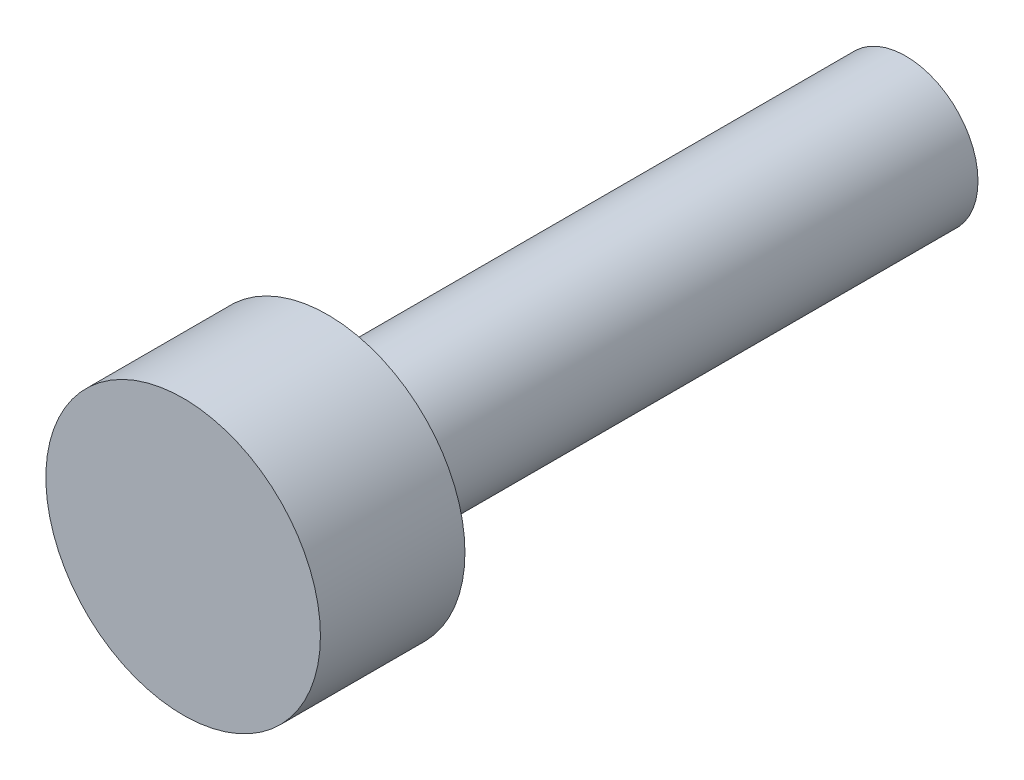
ISO-10303-21;
HEADER;
FILE_DESCRIPTION(('STEP AP214'),'2;1');
FILE_NAME('part.step','',(''),(''),'','','');
FILE_SCHEMA(('AUTOMOTIVE_DESIGN { 1 0 10303 214 1 1 1 1 }'));
ENDSEC;
DATA;
#1=APPLICATION_CONTEXT('core data for automotive mechanical design processes');
#2=APPLICATION_PROTOCOL_DEFINITION('international standard','automotive_design',2000,#1);
#3=PRODUCT_CONTEXT('',#1,'mechanical');
#4=PRODUCT('Part','Part','',(#3));
#5=PRODUCT_RELATED_PRODUCT_CATEGORY('part','',(#4));
#6=PRODUCT_DEFINITION_FORMATION('','',#4);
#7=PRODUCT_DEFINITION_CONTEXT('part definition',#1,'design');
#8=PRODUCT_DEFINITION('design','',#6,#7);
#9=PRODUCT_DEFINITION_SHAPE('','',#8);
#10=(LENGTH_UNIT() NAMED_UNIT(*) SI_UNIT(.MILLI.,.METRE.));
#11=(NAMED_UNIT(*) PLANE_ANGLE_UNIT() SI_UNIT($,.RADIAN.));
#12=(NAMED_UNIT(*) SI_UNIT($,.STERADIAN.) SOLID_ANGLE_UNIT());
#13=UNCERTAINTY_MEASURE_WITH_UNIT(LENGTH_MEASURE(1.E-05),#10,'distance_accuracy_value','');
#14=(GEOMETRIC_REPRESENTATION_CONTEXT(3) GLOBAL_UNCERTAINTY_ASSIGNED_CONTEXT((#13)) GLOBAL_UNIT_ASSIGNED_CONTEXT((#10,
#11,#12)) REPRESENTATION_CONTEXT('',''));
#15=CARTESIAN_POINT('',(0.,0.,0.));
#16=DIRECTION('',(0.,0.,1.));
#17=DIRECTION('',(1.,0.,0.));
#18=AXIS2_PLACEMENT_3D('',#15,#16,#17);
#19=CARTESIAN_POINT('',(0.,0.,12.));
#20=DIRECTION('',(0.,0.,-1.));
#21=DIRECTION('',(-1.,0.,0.));
#22=AXIS2_PLACEMENT_3D('',#19,#20,#21);
#23=CYLINDRICAL_SURFACE('',#22,1.5);
#24=CARTESIAN_POINT('',(0.,0.,12.));
#25=DIRECTION('',(0.,0.,1.));
#26=DIRECTION('',(1.,0.,0.));
#27=AXIS2_PLACEMENT_3D('',#24,#25,#26);
#28=CIRCLE('',#27,1.5);
#29=CARTESIAN_POINT('',(1.5,0.,12.));
#30=VERTEX_POINT('',#29);
#31=EDGE_CURVE('E10',#30,#30,#28,.T.);
#32=ORIENTED_EDGE('',*,*,#31,.F.);
#33=EDGE_LOOP('',(#32));
#34=FACE_BOUND('',#33,.T.);
#35=CARTESIAN_POINT('',(0.,0.,0.));
#36=DIRECTION('',(0.,0.,1.));
#37=DIRECTION('',(1.,0.,0.));
#38=AXIS2_PLACEMENT_3D('',#35,#36,#37);
#39=CIRCLE('',#38,1.5);
#40=CARTESIAN_POINT('',(1.5,0.,0.));
#41=VERTEX_POINT('',#40);
#42=EDGE_CURVE('E34',#41,#41,#39,.T.);
#43=ORIENTED_EDGE('',*,*,#42,.T.);
#44=EDGE_LOOP('',(#43));
#45=FACE_BOUND('',#44,.T.);
#46=ADVANCED_FACE('F31',(#34,#45),#23,.T.);
#47=CARTESIAN_POINT('',(0.,0.,0.));
#48=DIRECTION('',(0.,0.,1.));
#49=DIRECTION('',(1.,0.,0.));
#50=AXIS2_PLACEMENT_3D('',#47,#48,#49);
#51=PLANE('',#50);
#52=ORIENTED_EDGE('',*,*,#42,.F.);
#53=EDGE_LOOP('',(#52));
#54=FACE_BOUND('',#53,.T.);
#55=ADVANCED_FACE('F54',(#54),#51,.F.);
#56=CARTESIAN_POINT('',(0.,0.,15.));
#57=DIRECTION('',(0.,0.,-1.));
#58=DIRECTION('',(-1.,0.,0.));
#59=AXIS2_PLACEMENT_3D('',#56,#57,#58);
#60=CYLINDRICAL_SURFACE('',#59,2.85);
#61=CARTESIAN_POINT('',(0.,0.,15.));
#62=DIRECTION('',(0.,0.,1.));
#63=DIRECTION('',(1.,0.,0.));
#64=AXIS2_PLACEMENT_3D('',#61,#62,#63);
#65=CIRCLE('',#64,2.85);
#66=CARTESIAN_POINT('',(2.85,0.,15.));
#67=VERTEX_POINT('',#66);
#68=EDGE_CURVE('E41',#67,#67,#65,.T.);
#69=ORIENTED_EDGE('',*,*,#68,.F.);
#70=EDGE_LOOP('',(#69));
#71=FACE_BOUND('',#70,.T.);
#72=CARTESIAN_POINT('',(0.,0.,12.));
#73=DIRECTION('',(0.,0.,1.));
#74=DIRECTION('',(1.,0.,0.));
#75=AXIS2_PLACEMENT_3D('',#72,#73,#74);
#76=CIRCLE('',#75,2.85);
#77=CARTESIAN_POINT('',(2.85,0.,12.));
#78=VERTEX_POINT('',#77);
#79=EDGE_CURVE('E43',#78,#78,#76,.T.);
#80=ORIENTED_EDGE('',*,*,#79,.T.);
#81=EDGE_LOOP('',(#80));
#82=FACE_BOUND('',#81,.T.);
#83=ADVANCED_FACE('F51',(#71,#82),#60,.T.);
#84=CARTESIAN_POINT('',(0.,0.,15.));
#85=DIRECTION('',(0.,0.,1.));
#86=DIRECTION('',(1.,0.,0.));
#87=AXIS2_PLACEMENT_3D('',#84,#85,#86);
#88=PLANE('',#87);
#89=ORIENTED_EDGE('',*,*,#68,.T.);
#90=EDGE_LOOP('',(#89));
#91=FACE_BOUND('',#90,.T.);
#92=ADVANCED_FACE('F49',(#91),#88,.T.);
#93=CARTESIAN_POINT('',(0.,0.,12.));
#94=DIRECTION('',(0.,0.,1.));
#95=DIRECTION('',(1.,0.,0.));
#96=AXIS2_PLACEMENT_3D('',#93,#94,#95);
#97=PLANE('',#96);
#98=ORIENTED_EDGE('',*,*,#31,.T.);
#99=EDGE_LOOP('',(#98));
#100=FACE_BOUND('',#99,.T.);
#101=ORIENTED_EDGE('',*,*,#79,.F.);
#102=EDGE_LOOP('',(#101));
#103=FACE_BOUND('',#102,.T.);
#104=ADVANCED_FACE('F58',(#100,#103),#97,.F.);
#105=CLOSED_SHELL('',(#46,#55,#83,#92,#104));
#106=MANIFOLD_SOLID_BREP('B2',#105);
#107=ADVANCED_BREP_SHAPE_REPRESENTATION('',(#18,#106),#14);
#108=SHAPE_DEFINITION_REPRESENTATION(#9,#107);
ENDSEC;
END-ISO-10303-21;
